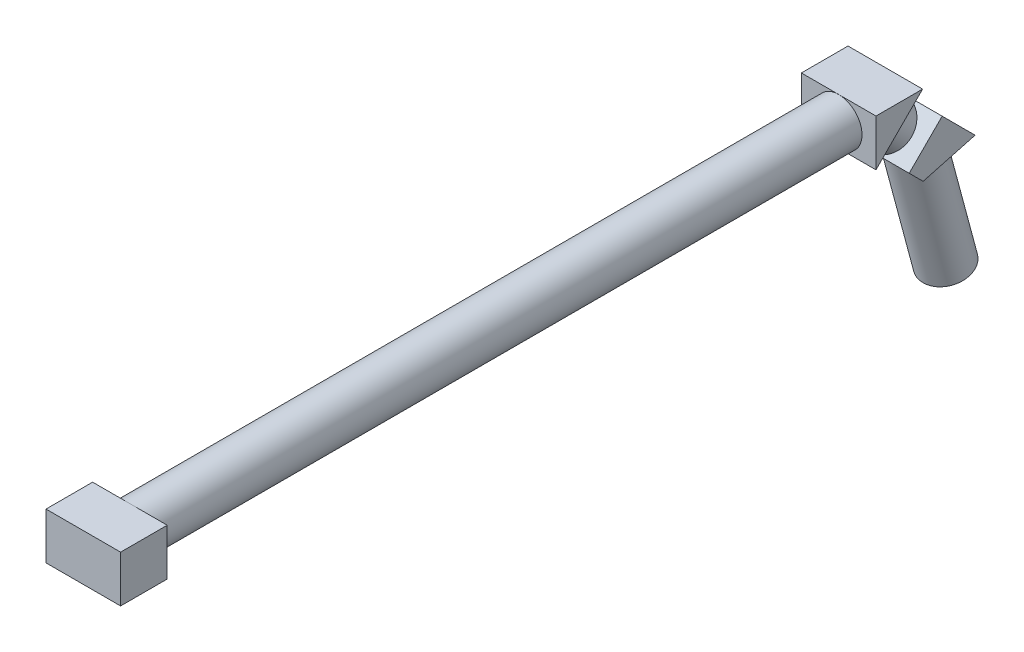
ISO-10303-21;
HEADER;
FILE_DESCRIPTION(('STEP AP214'),'2;1');
FILE_NAME('part.step','',(''),(''),'','','');
FILE_SCHEMA(('AUTOMOTIVE_DESIGN { 1 0 10303 214 1 1 1 1 }'));
ENDSEC;
DATA;
#1=APPLICATION_CONTEXT('core data for automotive mechanical design processes');
#2=APPLICATION_PROTOCOL_DEFINITION('international standard','automotive_design',2000,#1);
#3=PRODUCT_CONTEXT('',#1,'mechanical');
#4=PRODUCT('Part','Part','',(#3));
#5=PRODUCT_RELATED_PRODUCT_CATEGORY('part','',(#4));
#6=PRODUCT_DEFINITION_FORMATION('','',#4);
#7=PRODUCT_DEFINITION_CONTEXT('part definition',#1,'design');
#8=PRODUCT_DEFINITION('design','',#6,#7);
#9=PRODUCT_DEFINITION_SHAPE('','',#8);
#10=(LENGTH_UNIT() NAMED_UNIT(*) SI_UNIT(.MILLI.,.METRE.));
#11=(NAMED_UNIT(*) PLANE_ANGLE_UNIT() SI_UNIT($,.RADIAN.));
#12=(NAMED_UNIT(*) SI_UNIT($,.STERADIAN.) SOLID_ANGLE_UNIT());
#13=UNCERTAINTY_MEASURE_WITH_UNIT(LENGTH_MEASURE(1.E-05),#10,'distance_accuracy_value','');
#14=(GEOMETRIC_REPRESENTATION_CONTEXT(3) GLOBAL_UNCERTAINTY_ASSIGNED_CONTEXT((#13)) GLOBAL_UNIT_ASSIGNED_CONTEXT((#10,
#11,#12)) REPRESENTATION_CONTEXT('',''));
#15=CARTESIAN_POINT('',(0.,0.,0.));
#16=DIRECTION('',(0.,0.,1.));
#17=DIRECTION('',(1.,0.,0.));
#18=AXIS2_PLACEMENT_3D('',#15,#16,#17);
#19=CARTESIAN_POINT('',(0.,0.,430.));
#20=DIRECTION('',(0.,0.,-1.));
#21=DIRECTION('',(-1.,0.,0.));
#22=AXIS2_PLACEMENT_3D('',#19,#20,#21);
#23=CYLINDRICAL_SURFACE('',#22,12.5);
#24=CARTESIAN_POINT('',(0.,0.,405.));
#25=DIRECTION('',(0.,0.,-1.));
#26=DIRECTION('',(-1.,0.,0.));
#27=AXIS2_PLACEMENT_3D('',#24,#25,#26);
#28=CIRCLE('',#27,12.5);
#29=CARTESIAN_POINT('',(0.,-12.5,405.));
#30=VERTEX_POINT('',#29);
#31=CARTESIAN_POINT('',(0.,12.5,405.));
#32=VERTEX_POINT('',#31);
#33=EDGE_CURVE('E232',#30,#32,#28,.T.);
#34=ORIENTED_EDGE('',*,*,#33,.T.);
#35=EDGE_CURVE('E243',#32,#30,#28,.T.);
#36=ORIENTED_EDGE('',*,*,#35,.T.);
#37=EDGE_LOOP('',(#34,#36));
#38=FACE_BOUND('',#37,.T.);
#39=CARTESIAN_POINT('',(0.,0.,25.));
#40=DIRECTION('',(0.,0.,1.));
#41=DIRECTION('',(1.,0.,0.));
#42=AXIS2_PLACEMENT_3D('',#39,#40,#41);
#43=CIRCLE('',#42,12.5);
#44=CARTESIAN_POINT('',(0.,-12.5,24.9999999999999));
#45=VERTEX_POINT('',#44);
#46=CARTESIAN_POINT('',(0.,12.5,25.));
#47=VERTEX_POINT('',#46);
#48=EDGE_CURVE('E244',#45,#47,#43,.T.);
#49=ORIENTED_EDGE('',*,*,#48,.T.);
#50=EDGE_CURVE('E247',#47,#45,#43,.T.);
#51=ORIENTED_EDGE('',*,*,#50,.T.);
#52=EDGE_LOOP('',(#49,#51));
#53=FACE_BOUND('',#52,.T.);
#54=ADVANCED_FACE('F33',(#38,#53),#23,.T.);
#55=CARTESIAN_POINT('',(-20.,12.5,405.));
#56=DIRECTION('',(0.,0.,-1.));
#57=DIRECTION('',(-1.,0.,0.));
#58=AXIS2_PLACEMENT_3D('',#55,#56,#57);
#59=PLANE('',#58);
#60=ORIENTED_EDGE('',*,*,#35,.F.);
#61=DIRECTION('',(1.,0.,0.));
#62=VECTOR('',#61,1.);
#63=CARTESIAN_POINT('',(-20.,12.5,405.));
#64=LINE('',#63,#62);
#65=CARTESIAN_POINT('',(20.,12.5,405.));
#66=VERTEX_POINT('',#65);
#67=EDGE_CURVE('E235',#32,#66,#64,.T.);
#68=ORIENTED_EDGE('',*,*,#67,.T.);
#69=DIRECTION('',(0.,1.,0.));
#70=VECTOR('',#69,1.);
#71=CARTESIAN_POINT('',(20.,12.5,405.));
#72=LINE('',#71,#70);
#73=CARTESIAN_POINT('',(20.,-12.5,405.));
#74=VERTEX_POINT('',#73);
#75=EDGE_CURVE('E211',#74,#66,#72,.T.);
#76=ORIENTED_EDGE('',*,*,#75,.F.);
#77=DIRECTION('',(1.,0.,0.));
#78=VECTOR('',#77,1.);
#79=CARTESIAN_POINT('',(-20.,-12.5,405.));
#80=LINE('',#79,#78);
#81=EDGE_CURVE('E239',#30,#74,#80,.T.);
#82=ORIENTED_EDGE('',*,*,#81,.F.);
#83=EDGE_LOOP('',(#60,#68,#76,#82));
#84=FACE_BOUND('',#83,.T.);
#85=ADVANCED_FACE('F285',(#84),#59,.T.);
#86=CARTESIAN_POINT('',(-20.,12.5,430.));
#87=DIRECTION('',(0.,1.,0.));
#88=DIRECTION('',(0.,0.,1.));
#89=AXIS2_PLACEMENT_3D('',#86,#87,#88);
#90=PLANE('',#89);
#91=ORIENTED_EDGE('',*,*,#67,.F.);
#92=CARTESIAN_POINT('',(-20.,12.5,405.));
#93=VERTEX_POINT('',#92);
#94=EDGE_CURVE('E233',#93,#32,#64,.T.);
#95=ORIENTED_EDGE('',*,*,#94,.F.);
#96=DIRECTION('',(0.,0.,1.));
#97=VECTOR('',#96,1.);
#98=CARTESIAN_POINT('',(-20.,12.5,430.));
#99=LINE('',#98,#97);
#100=CARTESIAN_POINT('',(-20.,12.5,430.));
#101=VERTEX_POINT('',#100);
#102=EDGE_CURVE('E226',#93,#101,#99,.T.);
#103=ORIENTED_EDGE('',*,*,#102,.T.);
#104=DIRECTION('',(1.,0.,0.));
#105=VECTOR('',#104,1.);
#106=CARTESIAN_POINT('',(-20.,12.5,430.));
#107=LINE('',#106,#105);
#108=CARTESIAN_POINT('',(20.,12.5,430.));
#109=VERTEX_POINT('',#108);
#110=EDGE_CURVE('E230',#101,#109,#107,.T.);
#111=ORIENTED_EDGE('',*,*,#110,.T.);
#112=DIRECTION('',(0.,0.,1.));
#113=VECTOR('',#112,1.);
#114=CARTESIAN_POINT('',(20.,12.5,430.));
#115=LINE('',#114,#113);
#116=EDGE_CURVE('E214',#66,#109,#115,.T.);
#117=ORIENTED_EDGE('',*,*,#116,.F.);
#118=EDGE_LOOP('',(#91,#95,#103,#111,#117));
#119=FACE_BOUND('',#118,.T.);
#120=ADVANCED_FACE('F290',(#119),#90,.T.);
#121=CARTESIAN_POINT('',(-20.,-12.5,430.));
#122=DIRECTION('',(0.,-1.,0.));
#123=DIRECTION('',(0.,0.,-1.));
#124=AXIS2_PLACEMENT_3D('',#121,#122,#123);
#125=PLANE('',#124);
#126=CARTESIAN_POINT('',(-20.,-12.5,405.));
#127=VERTEX_POINT('',#126);
#128=EDGE_CURVE('E236',#127,#30,#80,.T.);
#129=ORIENTED_EDGE('',*,*,#128,.T.);
#130=ORIENTED_EDGE('',*,*,#81,.T.);
#131=DIRECTION('',(0.,0.,-1.));
#132=VECTOR('',#131,1.);
#133=CARTESIAN_POINT('',(20.,-12.5,430.));
#134=LINE('',#133,#132);
#135=CARTESIAN_POINT('',(20.,-12.5,430.));
#136=VERTEX_POINT('',#135);
#137=EDGE_CURVE('E208',#136,#74,#134,.T.);
#138=ORIENTED_EDGE('',*,*,#137,.F.);
#139=DIRECTION('',(1.,0.,0.));
#140=VECTOR('',#139,1.);
#141=CARTESIAN_POINT('',(-20.,-12.5,430.));
#142=LINE('',#141,#140);
#143=CARTESIAN_POINT('',(-20.,-12.5,430.));
#144=VERTEX_POINT('',#143);
#145=EDGE_CURVE('E229',#144,#136,#142,.T.);
#146=ORIENTED_EDGE('',*,*,#145,.F.);
#147=DIRECTION('',(0.,0.,-1.));
#148=VECTOR('',#147,1.);
#149=CARTESIAN_POINT('',(-20.,-12.5,430.));
#150=LINE('',#149,#148);
#151=EDGE_CURVE('E220',#144,#127,#150,.T.);
#152=ORIENTED_EDGE('',*,*,#151,.T.);
#153=EDGE_LOOP('',(#129,#130,#138,#146,#152));
#154=FACE_BOUND('',#153,.T.);
#155=ADVANCED_FACE('F303',(#154),#125,.T.);
#156=ORIENTED_EDGE('',*,*,#33,.F.);
#157=ORIENTED_EDGE('',*,*,#128,.F.);
#158=DIRECTION('',(0.,1.,0.));
#159=VECTOR('',#158,1.);
#160=CARTESIAN_POINT('',(-20.,12.5,405.));
#161=LINE('',#160,#159);
#162=EDGE_CURVE('E223',#127,#93,#161,.T.);
#163=ORIENTED_EDGE('',*,*,#162,.T.);
#164=ORIENTED_EDGE('',*,*,#94,.T.);
#165=EDGE_LOOP('',(#156,#157,#163,#164));
#166=FACE_BOUND('',#165,.T.);
#167=ADVANCED_FACE('F293',(#166),#59,.T.);
#168=CARTESIAN_POINT('',(-20.,0.,0.));
#169=DIRECTION('',(1.,0.,0.));
#170=DIRECTION('',(0.,0.,-1.));
#171=AXIS2_PLACEMENT_3D('',#168,#169,#170);
#172=PLANE('',#171);
#173=DIRECTION('',(0.,-1.,0.));
#174=VECTOR('',#173,1.);
#175=CARTESIAN_POINT('',(-20.,12.5,430.));
#176=LINE('',#175,#174);
#177=EDGE_CURVE('E217',#101,#144,#176,.T.);
#178=ORIENTED_EDGE('',*,*,#177,.F.);
#179=ORIENTED_EDGE('',*,*,#102,.F.);
#180=ORIENTED_EDGE('',*,*,#162,.F.);
#181=ORIENTED_EDGE('',*,*,#151,.F.);
#182=EDGE_LOOP('',(#178,#179,#180,#181));
#183=FACE_BOUND('',#182,.T.);
#184=ADVANCED_FACE('F307',(#183),#172,.F.);
#185=CARTESIAN_POINT('',(20.,0.,0.));
#186=DIRECTION('',(1.,0.,0.));
#187=DIRECTION('',(0.,0.,-1.));
#188=AXIS2_PLACEMENT_3D('',#185,#186,#187);
#189=PLANE('',#188);
#190=DIRECTION('',(0.,-1.,0.));
#191=VECTOR('',#190,1.);
#192=CARTESIAN_POINT('',(20.,12.5,430.));
#193=LINE('',#192,#191);
#194=EDGE_CURVE('E201',#109,#136,#193,.T.);
#195=ORIENTED_EDGE('',*,*,#194,.T.);
#196=ORIENTED_EDGE('',*,*,#137,.T.);
#197=ORIENTED_EDGE('',*,*,#75,.T.);
#198=ORIENTED_EDGE('',*,*,#116,.T.);
#199=EDGE_LOOP('',(#195,#196,#197,#198));
#200=FACE_BOUND('',#199,.T.);
#201=ADVANCED_FACE('F315',(#200),#189,.T.);
#202=CARTESIAN_POINT('',(0.,0.,430.));
#203=DIRECTION('',(0.,0.,1.));
#204=DIRECTION('',(1.,0.,0.));
#205=AXIS2_PLACEMENT_3D('',#202,#203,#204);
#206=PLANE('',#205);
#207=ORIENTED_EDGE('',*,*,#110,.F.);
#208=ORIENTED_EDGE('',*,*,#177,.T.);
#209=ORIENTED_EDGE('',*,*,#145,.T.);
#210=ORIENTED_EDGE('',*,*,#194,.F.);
#211=EDGE_LOOP('',(#207,#208,#209,#210));
#212=FACE_BOUND('',#211,.T.);
#213=ADVANCED_FACE('F310',(#212),#206,.T.);
#214=CARTESIAN_POINT('',(-20.,12.5,25.));
#215=DIRECTION('',(0.,0.,1.));
#216=DIRECTION('',(1.,0.,0.));
#217=AXIS2_PLACEMENT_3D('',#214,#215,#216);
#218=PLANE('',#217);
#219=ORIENTED_EDGE('',*,*,#50,.F.);
#220=DIRECTION('',(1.,0.,0.));
#221=VECTOR('',#220,1.);
#222=CARTESIAN_POINT('',(-20.,12.5,25.));
#223=LINE('',#222,#221);
#224=CARTESIAN_POINT('',(-20.,12.5,25.));
#225=VERTEX_POINT('',#224);
#226=EDGE_CURVE('E54',#225,#47,#223,.T.);
#227=ORIENTED_EDGE('',*,*,#226,.F.);
#228=DIRECTION('',(0.,-1.,0.));
#229=VECTOR('',#228,1.);
#230=CARTESIAN_POINT('',(-20.,12.5,25.));
#231=LINE('',#230,#229);
#232=CARTESIAN_POINT('',(-20.,-12.5,24.9999999999999));
#233=VERTEX_POINT('',#232);
#234=EDGE_CURVE('E194',#225,#233,#231,.T.);
#235=ORIENTED_EDGE('',*,*,#234,.T.);
#236=DIRECTION('',(1.,0.,0.));
#237=VECTOR('',#236,1.);
#238=CARTESIAN_POINT('',(-20.,-12.5,25.));
#239=LINE('',#238,#237);
#240=EDGE_CURVE('E198',#233,#45,#239,.T.);
#241=ORIENTED_EDGE('',*,*,#240,.T.);
#242=EDGE_LOOP('',(#219,#227,#235,#241));
#243=FACE_BOUND('',#242,.T.);
#244=ADVANCED_FACE('F282',(#243),#218,.T.);
#245=CARTESIAN_POINT('',(-20.,12.5,0.));
#246=DIRECTION('',(0.,1.,0.));
#247=DIRECTION('',(0.,0.,1.));
#248=AXIS2_PLACEMENT_3D('',#245,#246,#247);
#249=PLANE('',#248);
#250=DIRECTION('',(1.,0.,0.));
#251=VECTOR('',#250,1.);
#252=CARTESIAN_POINT('',(-20.,12.5,0.));
#253=LINE('',#252,#251);
#254=CARTESIAN_POINT('',(-20.,12.5,0.));
#255=VERTEX_POINT('',#254);
#256=CARTESIAN_POINT('',(20.,12.5,0.));
#257=VERTEX_POINT('',#256);
#258=EDGE_CURVE('E197',#255,#257,#253,.T.);
#259=ORIENTED_EDGE('',*,*,#258,.F.);
#260=DIRECTION('',(0.,0.,1.));
#261=VECTOR('',#260,1.);
#262=CARTESIAN_POINT('',(-20.,12.5,0.));
#263=LINE('',#262,#261);
#264=EDGE_CURVE('E192',#255,#225,#263,.T.);
#265=ORIENTED_EDGE('',*,*,#264,.T.);
#266=ORIENTED_EDGE('',*,*,#226,.T.);
#267=CARTESIAN_POINT('',(20.,12.5,25.));
#268=VERTEX_POINT('',#267);
#269=EDGE_CURVE('E204',#47,#268,#223,.T.);
#270=ORIENTED_EDGE('',*,*,#269,.T.);
#271=DIRECTION('',(0.,0.,1.));
#272=VECTOR('',#271,1.);
#273=CARTESIAN_POINT('',(20.,12.5,0.));
#274=LINE('',#273,#272);
#275=EDGE_CURVE('E186',#257,#268,#274,.T.);
#276=ORIENTED_EDGE('',*,*,#275,.F.);
#277=EDGE_LOOP('',(#259,#265,#266,#270,#276));
#278=FACE_BOUND('',#277,.T.);
#279=ADVANCED_FACE('F324',(#278),#249,.T.);
#280=ORIENTED_EDGE('',*,*,#48,.F.);
#281=CARTESIAN_POINT('',(20.,-12.5,24.9999999999999));
#282=VERTEX_POINT('',#281);
#283=EDGE_CURVE('E202',#45,#282,#239,.T.);
#284=ORIENTED_EDGE('',*,*,#283,.T.);
#285=DIRECTION('',(0.,-1.,0.));
#286=VECTOR('',#285,1.);
#287=CARTESIAN_POINT('',(20.,12.5,25.));
#288=LINE('',#287,#286);
#289=EDGE_CURVE('E189',#268,#282,#288,.T.);
#290=ORIENTED_EDGE('',*,*,#289,.F.);
#291=ORIENTED_EDGE('',*,*,#269,.F.);
#292=EDGE_LOOP('',(#280,#284,#290,#291));
#293=FACE_BOUND('',#292,.T.);
#294=ADVANCED_FACE('F277',(#293),#218,.T.);
#295=CARTESIAN_POINT('',(-20.,0.,0.));
#296=DIRECTION('',(-1.,0.,0.));
#297=DIRECTION('',(0.,0.,1.));
#298=AXIS2_PLACEMENT_3D('',#295,#296,#297);
#299=PLANE('',#298);
#300=DIRECTION('',(0.,-0.707106781186549,0.707106781186546));
#301=VECTOR('',#300,1.);
#302=CARTESIAN_POINT('',(-20.,12.5,0.));
#303=LINE('',#302,#301);
#304=EDGE_CURVE('E180',#255,#233,#303,.T.);
#305=ORIENTED_EDGE('',*,*,#304,.T.);
#306=ORIENTED_EDGE('',*,*,#234,.F.);
#307=ORIENTED_EDGE('',*,*,#264,.F.);
#308=EDGE_LOOP('',(#305,#306,#307));
#309=FACE_BOUND('',#308,.T.);
#310=ADVANCED_FACE('F381',(#309),#299,.T.);
#311=CARTESIAN_POINT('',(20.,0.,0.));
#312=DIRECTION('',(-1.,0.,0.));
#313=DIRECTION('',(0.,0.,1.));
#314=AXIS2_PLACEMENT_3D('',#311,#312,#313);
#315=PLANE('',#314);
#316=ORIENTED_EDGE('',*,*,#289,.T.);
#317=DIRECTION('',(0.,0.707106781186549,-0.707106781186546));
#318=VECTOR('',#317,1.);
#319=CARTESIAN_POINT('',(20.,6.24999999999998,6.25));
#320=LINE('',#319,#318);
#321=EDGE_CURVE('E183',#282,#257,#320,.T.);
#322=ORIENTED_EDGE('',*,*,#321,.T.);
#323=ORIENTED_EDGE('',*,*,#275,.T.);
#324=EDGE_LOOP('',(#316,#322,#323));
#325=FACE_BOUND('',#324,.T.);
#326=ADVANCED_FACE('F271',(#325),#315,.F.);
#327=CARTESIAN_POINT('',(-20.,12.5,0.));
#328=DIRECTION('',(0.,0.707106781186546,0.707106781186549));
#329=DIRECTION('',(0.,-0.707106781186549,0.707106781186546));
#330=AXIS2_PLACEMENT_3D('',#327,#328,#329);
#331=PLANE('',#330);
#332=CARTESIAN_POINT('',(0.,0.,12.5));
#333=DIRECTION('',(0.,0.707106781186546,0.707106781186549));
#334=DIRECTION('',(0.,-0.707106781186549,0.707106781186546));
#335=AXIS2_PLACEMENT_3D('',#332,#333,#334);
#336=CIRCLE('',#335,12.5);
#337=CARTESIAN_POINT('',(0.,-8.83883476483189,21.3388347648318));
#338=VERTEX_POINT('',#337);
#339=EDGE_CURVE('E248',#338,#338,#336,.F.);
#340=ORIENTED_EDGE('',*,*,#339,.F.);
#341=EDGE_LOOP('',(#340));
#342=FACE_BOUND('',#341,.T.);
#343=ORIENTED_EDGE('',*,*,#283,.F.);
#344=ORIENTED_EDGE('',*,*,#240,.F.);
#345=ORIENTED_EDGE('',*,*,#304,.F.);
#346=ORIENTED_EDGE('',*,*,#258,.T.);
#347=ORIENTED_EDGE('',*,*,#321,.F.);
#348=EDGE_LOOP('',(#343,#344,#345,#346,#347));
#349=FACE_BOUND('',#348,.T.);
#350=ADVANCED_FACE('F265',(#342,#349),#331,.F.);
#351=CARTESIAN_POINT('',(0.,-14.142135623731,-1.642135623731));
#352=DIRECTION('',(0.,0.707106781186546,0.707106781186549));
#353=DIRECTION('',(0.,-0.707106781186549,0.707106781186546));
#354=AXIS2_PLACEMENT_3D('',#351,#352,#353);
#355=CYLINDRICAL_SURFACE('',#354,12.5);
#356=CARTESIAN_POINT('',(0.,-14.142135623731,-1.642135623731));
#357=DIRECTION('',(0.,-0.707106781186546,-0.707106781186549));
#358=DIRECTION('',(0.,0.707106781186549,-0.707106781186546));
#359=AXIS2_PLACEMENT_3D('',#356,#357,#358);
#360=CIRCLE('',#359,12.5);
#361=CARTESIAN_POINT('',(0.,-5.30330085889909,-10.4809703885628));
#362=VERTEX_POINT('',#361);
#363=CARTESIAN_POINT('',(0.,-22.9809703885628,7.19669914110083));
#364=VERTEX_POINT('',#363);
#365=EDGE_CURVE('E178',#362,#364,#360,.T.);
#366=ORIENTED_EDGE('',*,*,#365,.F.);
#367=EDGE_CURVE('E46',#364,#362,#360,.T.);
#368=ORIENTED_EDGE('',*,*,#367,.F.);
#369=EDGE_LOOP('',(#366,#368));
#370=FACE_BOUND('',#369,.T.);
#371=ORIENTED_EDGE('',*,*,#339,.T.);
#372=EDGE_LOOP('',(#371));
#373=FACE_BOUND('',#372,.T.);
#374=ADVANCED_FACE('F262',(#370,#373),#355,.T.);
#375=CARTESIAN_POINT('',(-20.,-22.9809703885628,7.19669914110082));
#376=DIRECTION('',(0.,0.707106781186546,0.707106781186549));
#377=DIRECTION('',(0.,-0.707106781186549,0.707106781186546));
#378=AXIS2_PLACEMENT_3D('',#375,#376,#377);
#379=PLANE('',#378);
#380=DIRECTION('',(1.,0.,0.));
#381=VECTOR('',#380,1.);
#382=CARTESIAN_POINT('',(-20.,-5.30330085889909,-10.4809703885628));
#383=LINE('',#382,#381);
#384=CARTESIAN_POINT('',(20.,-5.30330085889909,-10.4809703885628));
#385=VERTEX_POINT('',#384);
#386=EDGE_CURVE('E169',#362,#385,#383,.T.);
#387=ORIENTED_EDGE('',*,*,#386,.F.);
#388=ORIENTED_EDGE('',*,*,#365,.T.);
#389=DIRECTION('',(1.,0.,0.));
#390=VECTOR('',#389,1.);
#391=CARTESIAN_POINT('',(-20.,-22.9809703885628,7.19669914110082));
#392=LINE('',#391,#390);
#393=CARTESIAN_POINT('',(20.,-22.9809703885628,7.19669914110082));
#394=VERTEX_POINT('',#393);
#395=EDGE_CURVE('E175',#364,#394,#392,.T.);
#396=ORIENTED_EDGE('',*,*,#395,.T.);
#397=DIRECTION('',(0.,-0.707106781186549,0.707106781186546));
#398=VECTOR('',#397,1.);
#399=CARTESIAN_POINT('',(20.,-22.9809703885628,7.19669914110082));
#400=LINE('',#399,#398);
#401=EDGE_CURVE('E164',#385,#394,#400,.T.);
#402=ORIENTED_EDGE('',*,*,#401,.F.);
#403=EDGE_LOOP('',(#387,#388,#396,#402));
#404=FACE_BOUND('',#403,.T.);
#405=ADVANCED_FACE('F261',(#404),#379,.T.);
#406=CARTESIAN_POINT('',(-20.,-5.30330085889909,-10.4809703885628));
#407=DIRECTION('',(0.,0.707106781186549,-0.707106781186546));
#408=DIRECTION('',(0.,0.707106781186546,0.707106781186549));
#409=AXIS2_PLACEMENT_3D('',#406,#407,#408);
#410=PLANE('',#409);
#411=DIRECTION('',(0.,0.707106781186546,0.707106781186549));
#412=VECTOR('',#411,1.);
#413=CARTESIAN_POINT('',(20.,-5.30330085889909,-10.4809703885628));
#414=LINE('',#413,#412);
#415=CARTESIAN_POINT('',(20.,-22.9809703885627,-28.1586399182265));
#416=VERTEX_POINT('',#415);
#417=EDGE_CURVE('E152',#416,#385,#414,.T.);
#418=ORIENTED_EDGE('',*,*,#417,.F.);
#419=DIRECTION('',(1.,0.,0.));
#420=VECTOR('',#419,1.);
#421=CARTESIAN_POINT('',(-20.,-22.9809703885627,-28.1586399182265));
#422=LINE('',#421,#420);
#423=CARTESIAN_POINT('',(-20.,-22.9809703885627,-28.1586399182265));
#424=VERTEX_POINT('',#423);
#425=EDGE_CURVE('E135',#424,#416,#422,.T.);
#426=ORIENTED_EDGE('',*,*,#425,.F.);
#427=DIRECTION('',(0.,0.707106781186546,0.707106781186549));
#428=VECTOR('',#427,1.);
#429=CARTESIAN_POINT('',(-20.,-5.30330085889909,-10.4809703885628));
#430=LINE('',#429,#428);
#431=CARTESIAN_POINT('',(-20.,-5.30330085889909,-10.4809703885628));
#432=VERTEX_POINT('',#431);
#433=EDGE_CURVE('E150',#424,#432,#430,.T.);
#434=ORIENTED_EDGE('',*,*,#433,.T.);
#435=EDGE_CURVE('E176',#432,#362,#383,.T.);
#436=ORIENTED_EDGE('',*,*,#435,.T.);
#437=ORIENTED_EDGE('',*,*,#386,.T.);
#438=EDGE_LOOP('',(#418,#426,#434,#436,#437));
#439=FACE_BOUND('',#438,.T.);
#440=ADVANCED_FACE('F148',(#439),#410,.T.);
#441=CARTESIAN_POINT('',(-20.,-22.9809703885628,7.19669914110082));
#442=DIRECTION('',(0.,-0.707106781186548,0.707106781186547));
#443=DIRECTION('',(0.,-0.707106781186547,-0.707106781186548));
#444=AXIS2_PLACEMENT_3D('',#441,#442,#443);
#445=PLANE('',#444);
#446=DIRECTION('',(1.,0.,0.));
#447=VECTOR('',#446,1.);
#448=CARTESIAN_POINT('',(-20.,-30.4524326566299,-0.274763126966282));
#449=LINE('',#448,#447);
#450=CARTESIAN_POINT('',(-20.,-30.4524326566299,-0.274763126966282));
#451=VERTEX_POINT('',#450);
#452=CARTESIAN_POINT('',(20.,-30.4524326566299,-0.274763126966282));
#453=VERTEX_POINT('',#452);
#454=EDGE_CURVE('E138',#451,#453,#449,.T.);
#455=ORIENTED_EDGE('',*,*,#454,.T.);
#456=DIRECTION('',(0.,-0.707106781186547,-0.707106781186548));
#457=VECTOR('',#456,1.);
#458=CARTESIAN_POINT('',(20.,-22.9809703885628,7.19669914110082));
#459=LINE('',#458,#457);
#460=EDGE_CURVE('E159',#394,#453,#459,.T.);
#461=ORIENTED_EDGE('',*,*,#460,.F.);
#462=ORIENTED_EDGE('',*,*,#395,.F.);
#463=CARTESIAN_POINT('',(-20.,-22.9809703885628,7.19669914110082));
#464=VERTEX_POINT('',#463);
#465=EDGE_CURVE('E153',#464,#364,#392,.T.);
#466=ORIENTED_EDGE('',*,*,#465,.F.);
#467=DIRECTION('',(0.,-0.707106781186547,-0.707106781186548));
#468=VECTOR('',#467,1.);
#469=CARTESIAN_POINT('',(-20.,-22.9809703885628,7.19669914110082));
#470=LINE('',#469,#468);
#471=EDGE_CURVE('E161',#464,#451,#470,.T.);
#472=ORIENTED_EDGE('',*,*,#471,.T.);
#473=EDGE_LOOP('',(#455,#461,#462,#466,#472));
#474=FACE_BOUND('',#473,.T.);
#475=ADVANCED_FACE('F254',(#474),#445,.T.);
#476=ORIENTED_EDGE('',*,*,#465,.T.);
#477=ORIENTED_EDGE('',*,*,#367,.T.);
#478=ORIENTED_EDGE('',*,*,#435,.F.);
#479=DIRECTION('',(0.,-0.707106781186549,0.707106781186546));
#480=VECTOR('',#479,1.);
#481=CARTESIAN_POINT('',(-20.,-22.9809703885628,7.19669914110082));
#482=LINE('',#481,#480);
#483=EDGE_CURVE('E158',#432,#464,#482,.T.);
#484=ORIENTED_EDGE('',*,*,#483,.T.);
#485=EDGE_LOOP('',(#476,#477,#478,#484));
#486=FACE_BOUND('',#485,.T.);
#487=ADVANCED_FACE('F257',(#486),#379,.T.);
#488=CARTESIAN_POINT('',(-20.,0.,0.));
#489=DIRECTION('',(-1.,0.,0.));
#490=DIRECTION('',(0.,0.,1.));
#491=AXIS2_PLACEMENT_3D('',#488,#489,#490);
#492=PLANE('',#491);
#493=DIRECTION('',(0.,-0.258819045102523,0.965925826289068));
#494=VECTOR('',#493,1.);
#495=CARTESIAN_POINT('',(-20.,-22.9809703885627,-28.1586399182265));
#496=LINE('',#495,#494);
#497=EDGE_CURVE('E132',#424,#451,#496,.T.);
#498=ORIENTED_EDGE('',*,*,#497,.T.);
#499=ORIENTED_EDGE('',*,*,#471,.F.);
#500=ORIENTED_EDGE('',*,*,#483,.F.);
#501=ORIENTED_EDGE('',*,*,#433,.F.);
#502=EDGE_LOOP('',(#498,#499,#500,#501));
#503=FACE_BOUND('',#502,.T.);
#504=ADVANCED_FACE('F156',(#503),#492,.T.);
#505=CARTESIAN_POINT('',(20.,0.,0.));
#506=DIRECTION('',(-1.,0.,0.));
#507=DIRECTION('',(0.,0.,1.));
#508=AXIS2_PLACEMENT_3D('',#505,#506,#507);
#509=PLANE('',#508);
#510=ORIENTED_EDGE('',*,*,#460,.T.);
#511=DIRECTION('',(0.,0.258819045102523,-0.965925826289068));
#512=VECTOR('',#511,1.);
#513=CARTESIAN_POINT('',(20.,-28.4811972538947,-7.63151380365267));
#514=LINE('',#513,#512);
#515=EDGE_CURVE('E40',#453,#416,#514,.T.);
#516=ORIENTED_EDGE('',*,*,#515,.T.);
#517=ORIENTED_EDGE('',*,*,#417,.T.);
#518=ORIENTED_EDGE('',*,*,#401,.T.);
#519=EDGE_LOOP('',(#510,#516,#517,#518));
#520=FACE_BOUND('',#519,.T.);
#521=ADVANCED_FACE('F251',(#520),#509,.F.);
#522=CARTESIAN_POINT('',(-20.,-22.9809703885627,-28.1586399182265));
#523=DIRECTION('',(0.,0.965925826289068,0.258819045102523));
#524=DIRECTION('',(0.,-0.258819045102523,0.965925826289068));
#525=AXIS2_PLACEMENT_3D('',#522,#523,#524);
#526=PLANE('',#525);
#527=CARTESIAN_POINT('',(0.,-26.7167015225963,-14.2167015225964));
#528=DIRECTION('',(0.,0.965925826289068,0.258819045102523));
#529=DIRECTION('',(0.,-0.258819045102523,0.965925826289068));
#530=AXIS2_PLACEMENT_3D('',#527,#528,#529);
#531=CIRCLE('',#530,12.5);
#532=CARTESIAN_POINT('',(0.,-29.9519395863779,-2.14262869398307));
#533=VERTEX_POINT('',#532);
#534=EDGE_CURVE('E11',#533,#533,#531,.F.);
#535=ORIENTED_EDGE('',*,*,#534,.F.);
#536=EDGE_LOOP('',(#535));
#537=FACE_BOUND('',#536,.T.);
#538=ORIENTED_EDGE('',*,*,#454,.F.);
#539=ORIENTED_EDGE('',*,*,#497,.F.);
#540=ORIENTED_EDGE('',*,*,#425,.T.);
#541=ORIENTED_EDGE('',*,*,#515,.F.);
#542=EDGE_LOOP('',(#538,#539,#540,#541));
#543=FACE_BOUND('',#542,.T.);
#544=ADVANCED_FACE('F134',(#537,#543),#526,.F.);
#545=CARTESIAN_POINT('',(0.,-94.3315093628311,-32.334034679773));
#546=DIRECTION('',(0.,0.965925826289068,0.258819045102523));
#547=DIRECTION('',(0.,-0.258819045102523,0.965925826289068));
#548=AXIS2_PLACEMENT_3D('',#545,#546,#547);
#549=CYLINDRICAL_SURFACE('',#548,12.5);
#550=CARTESIAN_POINT('',(0.,-94.3315093628311,-32.334034679773));
#551=DIRECTION('',(0.,-0.965925826289068,-0.258819045102523));
#552=DIRECTION('',(0.,0.258819045102523,-0.965925826289068));
#553=AXIS2_PLACEMENT_3D('',#550,#551,#552);
#554=CIRCLE('',#553,12.5);
#555=CARTESIAN_POINT('',(0.,-91.0962712990495,-44.4081075083864));
#556=VERTEX_POINT('',#555);
#557=EDGE_CURVE('E143',#556,#556,#554,.T.);
#558=ORIENTED_EDGE('',*,*,#557,.F.);
#559=EDGE_LOOP('',(#558));
#560=FACE_BOUND('',#559,.T.);
#561=ORIENTED_EDGE('',*,*,#534,.T.);
#562=EDGE_LOOP('',(#561));
#563=FACE_BOUND('',#562,.T.);
#564=ADVANCED_FACE('F466',(#560,#563),#549,.T.);
#565=CARTESIAN_POINT('',(0.,-94.3315093628311,-32.334034679773));
#566=DIRECTION('',(0.,-0.965925826289068,-0.258819045102523));
#567=DIRECTION('',(0.,0.258819045102523,-0.965925826289068));
#568=AXIS2_PLACEMENT_3D('',#565,#566,#567);
#569=PLANE('',#568);
#570=ORIENTED_EDGE('',*,*,#557,.T.);
#571=EDGE_LOOP('',(#570));
#572=FACE_BOUND('',#571,.T.);
#573=ADVANCED_FACE('F476',(#572),#569,.T.);
#574=CLOSED_SHELL('',(#54,#85,#120,#155,#167,#184,#201,#213,#244,#279,#294,#310,#326,#350,#374,
#405,#440,#475,#487,#504,#521,#544,#564,#573));
#575=MANIFOLD_SOLID_BREP('B2',#574);
#576=ADVANCED_BREP_SHAPE_REPRESENTATION('',(#18,#575),#14);
#577=SHAPE_DEFINITION_REPRESENTATION(#9,#576);
ENDSEC;
END-ISO-10303-21;
